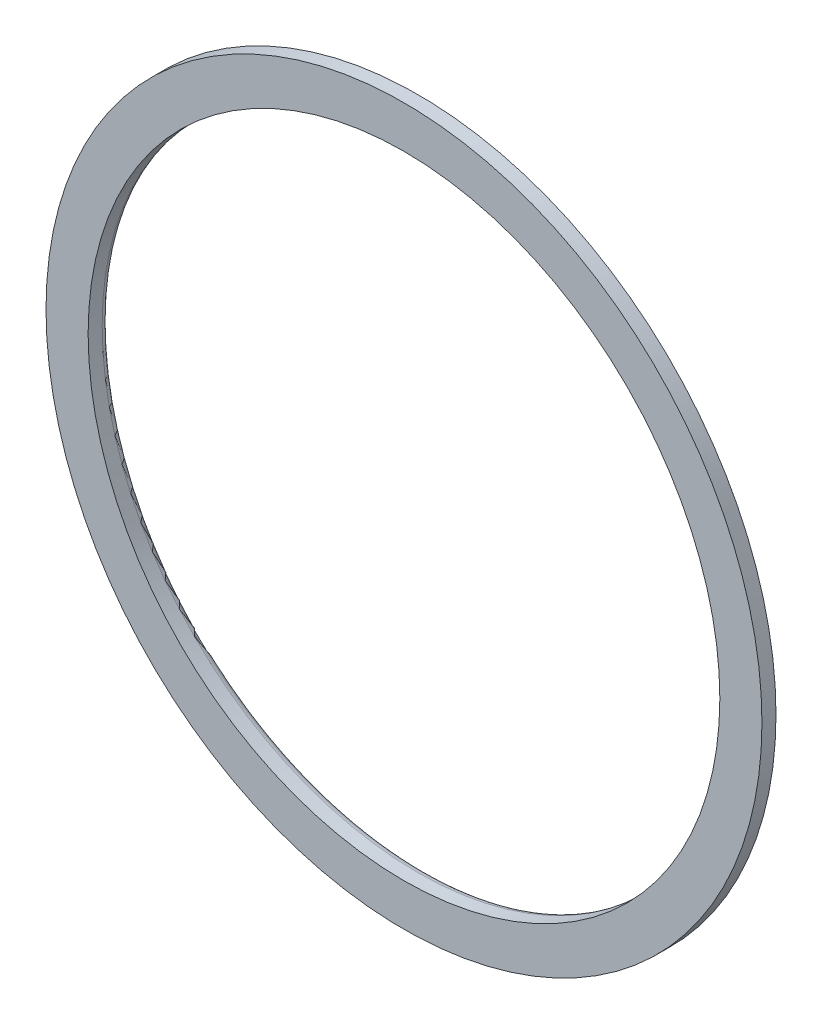
ISO-10303-21;
HEADER;
FILE_DESCRIPTION(('STEP AP214'),'2;1');
FILE_NAME('part.step','',(''),(''),'','','');
FILE_SCHEMA(('AUTOMOTIVE_DESIGN { 1 0 10303 214 1 1 1 1 }'));
ENDSEC;
DATA;
#1=APPLICATION_CONTEXT('core data for automotive mechanical design processes');
#2=APPLICATION_PROTOCOL_DEFINITION('international standard','automotive_design',2000,#1);
#3=PRODUCT_CONTEXT('',#1,'mechanical');
#4=PRODUCT('Part','Part','',(#3));
#5=PRODUCT_RELATED_PRODUCT_CATEGORY('part','',(#4));
#6=PRODUCT_DEFINITION_FORMATION('','',#4);
#7=PRODUCT_DEFINITION_CONTEXT('part definition',#1,'design');
#8=PRODUCT_DEFINITION('design','',#6,#7);
#9=PRODUCT_DEFINITION_SHAPE('','',#8);
#10=(LENGTH_UNIT() NAMED_UNIT(*) SI_UNIT(.MILLI.,.METRE.));
#11=(NAMED_UNIT(*) PLANE_ANGLE_UNIT() SI_UNIT($,.RADIAN.));
#12=(NAMED_UNIT(*) SI_UNIT($,.STERADIAN.) SOLID_ANGLE_UNIT());
#13=UNCERTAINTY_MEASURE_WITH_UNIT(LENGTH_MEASURE(1.E-05),#10,'distance_accuracy_value','');
#14=(GEOMETRIC_REPRESENTATION_CONTEXT(3) GLOBAL_UNCERTAINTY_ASSIGNED_CONTEXT((#13)) GLOBAL_UNIT_ASSIGNED_CONTEXT((#10,
#11,#12)) REPRESENTATION_CONTEXT('',''));
#15=CARTESIAN_POINT('',(0.,0.,0.));
#16=DIRECTION('',(0.,0.,1.));
#17=DIRECTION('',(1.,0.,0.));
#18=AXIS2_PLACEMENT_3D('',#15,#16,#17);
#19=CARTESIAN_POINT('',(0.,0.,-2.));
#20=DIRECTION('',(0.,0.,1.));
#21=DIRECTION('',(1.,0.,0.));
#22=AXIS2_PLACEMENT_3D('',#19,#20,#21);
#23=PLANE('',#22);
#24=CARTESIAN_POINT('',(0.,0.,-2.));
#25=DIRECTION('',(0.,0.,1.));
#26=DIRECTION('',(1.,0.,0.));
#27=AXIS2_PLACEMENT_3D('',#24,#25,#26);
#28=CIRCLE('',#27,51.);
#29=CARTESIAN_POINT('',(51.,0.,-2.));
#30=VERTEX_POINT('',#29);
#31=EDGE_CURVE('E52',#30,#30,#28,.T.);
#32=ORIENTED_EDGE('',*,*,#31,.F.);
#33=EDGE_LOOP('',(#32));
#34=FACE_BOUND('',#33,.T.);
#35=CARTESIAN_POINT('',(0.,0.,-2.));
#36=DIRECTION('',(0.,0.,1.));
#37=DIRECTION('',(1.,0.,0.));
#38=AXIS2_PLACEMENT_3D('',#35,#36,#37);
#39=CIRCLE('',#38,47.);
#40=CARTESIAN_POINT('',(47.,0.,-2.));
#41=VERTEX_POINT('',#40);
#42=EDGE_CURVE('E10',#41,#41,#39,.T.);
#43=ORIENTED_EDGE('',*,*,#42,.T.);
#44=EDGE_LOOP('',(#43));
#45=FACE_BOUND('',#44,.T.);
#46=ADVANCED_FACE('F33',(#34,#45),#23,.F.);
#47=CARTESIAN_POINT('',(0.,0.,-2.));
#48=DIRECTION('',(0.,0.,1.));
#49=DIRECTION('',(1.,0.,0.));
#50=AXIS2_PLACEMENT_3D('',#47,#48,#49);
#51=TOROIDAL_SURFACE('',#50,46.,1.);
#52=CARTESIAN_POINT('',(0.,0.,-2.));
#53=DIRECTION('',(0.,0.,1.));
#54=DIRECTION('',(1.,0.,0.));
#55=AXIS2_PLACEMENT_3D('',#52,#53,#54);
#56=CIRCLE('',#55,45.);
#57=CARTESIAN_POINT('',(45.,0.,-2.));
#58=VERTEX_POINT('',#57);
#59=EDGE_CURVE('E39',#58,#58,#56,.T.);
#60=ORIENTED_EDGE('',*,*,#59,.T.);
#61=EDGE_LOOP('',(#60));
#62=FACE_BOUND('',#61,.T.);
#63=ORIENTED_EDGE('',*,*,#42,.F.);
#64=EDGE_LOOP('',(#63));
#65=FACE_BOUND('',#64,.T.);
#66=ADVANCED_FACE('F60',(#62,#65),#51,.T.);
#67=CARTESIAN_POINT('',(0.,0.,0.));
#68=DIRECTION('',(0.,0.,1.));
#69=DIRECTION('',(1.,0.,0.));
#70=AXIS2_PLACEMENT_3D('',#67,#68,#69);
#71=CYLINDRICAL_SURFACE('',#70,45.);
#72=ORIENTED_EDGE('',*,*,#59,.F.);
#73=EDGE_LOOP('',(#72));
#74=FACE_BOUND('',#73,.T.);
#75=CARTESIAN_POINT('',(0.,0.,0.));
#76=DIRECTION('',(0.,0.,1.));
#77=DIRECTION('',(1.,0.,0.));
#78=AXIS2_PLACEMENT_3D('',#75,#76,#77);
#79=CIRCLE('',#78,45.);
#80=CARTESIAN_POINT('',(45.,0.,0.));
#81=VERTEX_POINT('',#80);
#82=EDGE_CURVE('E43',#81,#81,#79,.T.);
#83=ORIENTED_EDGE('',*,*,#82,.T.);
#84=EDGE_LOOP('',(#83));
#85=FACE_BOUND('',#84,.T.);
#86=ADVANCED_FACE('F64',(#74,#85),#71,.F.);
#87=CARTESIAN_POINT('',(0.,0.,0.));
#88=DIRECTION('',(0.,0.,1.));
#89=DIRECTION('',(1.,0.,0.));
#90=AXIS2_PLACEMENT_3D('',#87,#88,#89);
#91=PLANE('',#90);
#92=CARTESIAN_POINT('',(0.,0.,0.));
#93=DIRECTION('',(0.,0.,1.));
#94=DIRECTION('',(1.,0.,0.));
#95=AXIS2_PLACEMENT_3D('',#92,#93,#94);
#96=CIRCLE('',#95,51.);
#97=CARTESIAN_POINT('',(51.,0.,0.));
#98=VERTEX_POINT('',#97);
#99=EDGE_CURVE('E47',#98,#98,#96,.T.);
#100=ORIENTED_EDGE('',*,*,#99,.T.);
#101=EDGE_LOOP('',(#100));
#102=FACE_BOUND('',#101,.T.);
#103=ORIENTED_EDGE('',*,*,#82,.F.);
#104=EDGE_LOOP('',(#103));
#105=FACE_BOUND('',#104,.T.);
#106=ADVANCED_FACE('F68',(#102,#105),#91,.T.);
#107=CARTESIAN_POINT('',(0.,0.,0.));
#108=DIRECTION('',(0.,0.,1.));
#109=DIRECTION('',(1.,0.,0.));
#110=AXIS2_PLACEMENT_3D('',#107,#108,#109);
#111=CYLINDRICAL_SURFACE('',#110,51.);
#112=ORIENTED_EDGE('',*,*,#31,.T.);
#113=EDGE_LOOP('',(#112));
#114=FACE_BOUND('',#113,.T.);
#115=ORIENTED_EDGE('',*,*,#99,.F.);
#116=EDGE_LOOP('',(#115));
#117=FACE_BOUND('',#116,.T.);
#118=ADVANCED_FACE('F56',(#114,#117),#111,.T.);
#119=CLOSED_SHELL('',(#46,#66,#86,#106,#118));
#120=MANIFOLD_SOLID_BREP('B2',#119);
#121=ADVANCED_BREP_SHAPE_REPRESENTATION('',(#18,#120),#14);
#122=SHAPE_DEFINITION_REPRESENTATION(#9,#121);
ENDSEC;
END-ISO-10303-21;
